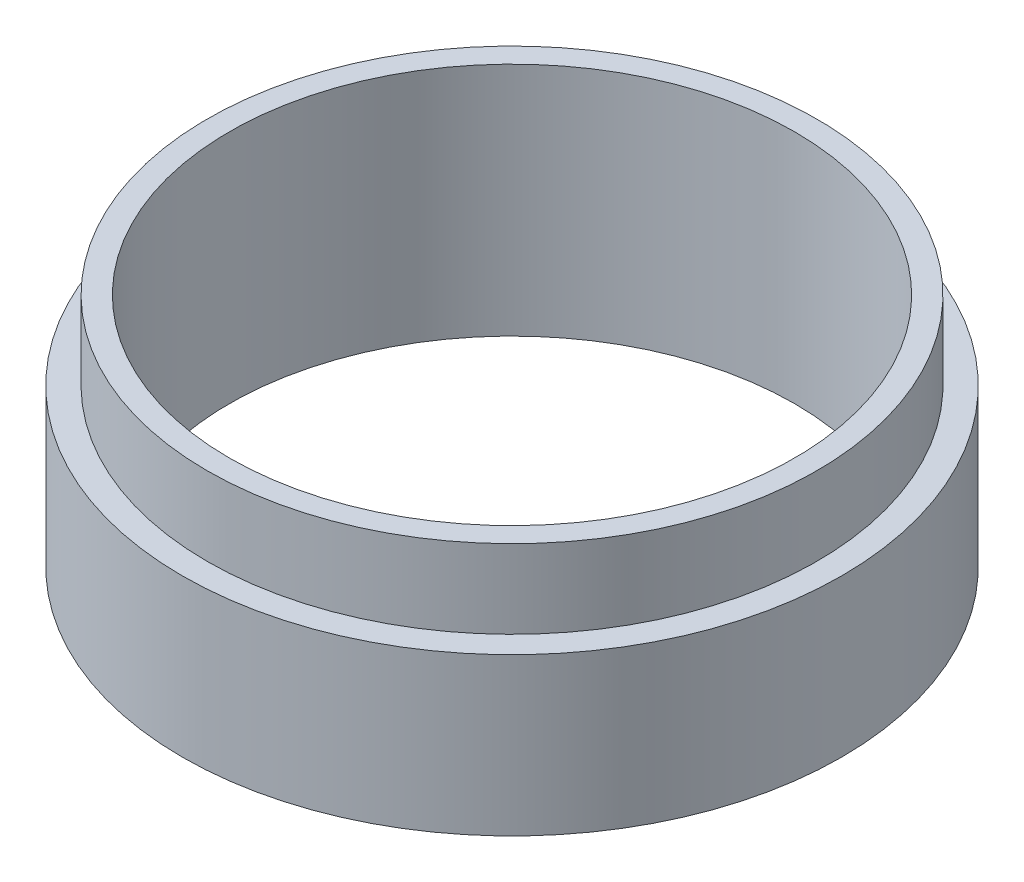
ISO-10303-21;
HEADER;
FILE_DESCRIPTION(('STEP AP214'),'2;1');
FILE_NAME('part.step','',(''),(''),'','','');
FILE_SCHEMA(('AUTOMOTIVE_DESIGN { 1 0 10303 214 1 1 1 1 }'));
ENDSEC;
DATA;
#1=APPLICATION_CONTEXT('core data for automotive mechanical design processes');
#2=APPLICATION_PROTOCOL_DEFINITION('international standard','automotive_design',2000,#1);
#3=PRODUCT_CONTEXT('',#1,'mechanical');
#4=PRODUCT('Part','Part','',(#3));
#5=PRODUCT_RELATED_PRODUCT_CATEGORY('part','',(#4));
#6=PRODUCT_DEFINITION_FORMATION('','',#4);
#7=PRODUCT_DEFINITION_CONTEXT('part definition',#1,'design');
#8=PRODUCT_DEFINITION('design','',#6,#7);
#9=PRODUCT_DEFINITION_SHAPE('','',#8);
#10=(LENGTH_UNIT() NAMED_UNIT(*) SI_UNIT(.MILLI.,.METRE.));
#11=(NAMED_UNIT(*) PLANE_ANGLE_UNIT() SI_UNIT($,.RADIAN.));
#12=(NAMED_UNIT(*) SI_UNIT($,.STERADIAN.) SOLID_ANGLE_UNIT());
#13=UNCERTAINTY_MEASURE_WITH_UNIT(LENGTH_MEASURE(1.E-05),#10,'distance_accuracy_value','');
#14=(GEOMETRIC_REPRESENTATION_CONTEXT(3) GLOBAL_UNCERTAINTY_ASSIGNED_CONTEXT((#13)) GLOBAL_UNIT_ASSIGNED_CONTEXT((#10,
#11,#12)) REPRESENTATION_CONTEXT('',''));
#15=CARTESIAN_POINT('',(0.,0.,0.));
#16=DIRECTION('',(0.,0.,1.));
#17=DIRECTION('',(1.,0.,0.));
#18=AXIS2_PLACEMENT_3D('',#15,#16,#17);
#19=CARTESIAN_POINT('',(0.,0.,0.));
#20=DIRECTION('',(0.,-1.,0.));
#21=DIRECTION('',(0.,0.,-1.));
#22=AXIS2_PLACEMENT_3D('',#19,#20,#21);
#23=CYLINDRICAL_SURFACE('',#22,21.);
#24=CARTESIAN_POINT('',(0.,10.,0.));
#25=DIRECTION('',(0.,-1.,0.));
#26=DIRECTION('',(0.,0.,-1.));
#27=AXIS2_PLACEMENT_3D('',#24,#25,#26);
#28=CIRCLE('',#27,21.);
#29=CARTESIAN_POINT('',(0.,10.,-21.));
#30=VERTEX_POINT('',#29);
#31=EDGE_CURVE('E37',#30,#30,#28,.T.);
#32=ORIENTED_EDGE('',*,*,#31,.T.);
#33=EDGE_LOOP('',(#32));
#34=FACE_BOUND('',#33,.T.);
#35=CARTESIAN_POINT('',(0.,0.,0.));
#36=DIRECTION('',(0.,-1.,0.));
#37=DIRECTION('',(0.,0.,-1.));
#38=AXIS2_PLACEMENT_3D('',#35,#36,#37);
#39=CIRCLE('',#38,21.);
#40=CARTESIAN_POINT('',(0.,0.,-21.));
#41=VERTEX_POINT('',#40);
#42=EDGE_CURVE('E48',#41,#41,#39,.T.);
#43=ORIENTED_EDGE('',*,*,#42,.F.);
#44=EDGE_LOOP('',(#43));
#45=FACE_BOUND('',#44,.T.);
#46=ADVANCED_FACE('F40',(#34,#45),#23,.T.);
#47=CARTESIAN_POINT('',(0.,10.,0.));
#48=DIRECTION('',(0.,1.,0.));
#49=DIRECTION('',(0.,0.,1.));
#50=AXIS2_PLACEMENT_3D('',#47,#48,#49);
#51=PLANE('',#50);
#52=CARTESIAN_POINT('',(0.,10.,0.));
#53=DIRECTION('',(0.,1.,0.));
#54=DIRECTION('',(0.,0.,1.));
#55=AXIS2_PLACEMENT_3D('',#52,#53,#54);
#56=CIRCLE('',#55,19.41);
#57=CARTESIAN_POINT('',(0.,10.,19.41));
#58=VERTEX_POINT('',#57);
#59=EDGE_CURVE('E10',#58,#58,#56,.T.);
#60=ORIENTED_EDGE('',*,*,#59,.F.);
#61=EDGE_LOOP('',(#60));
#62=FACE_BOUND('',#61,.T.);
#63=ORIENTED_EDGE('',*,*,#31,.F.);
#64=EDGE_LOOP('',(#63));
#65=FACE_BOUND('',#64,.T.);
#66=ADVANCED_FACE('F61',(#62,#65),#51,.T.);
#67=CARTESIAN_POINT('',(0.,0.,0.));
#68=DIRECTION('',(0.,-1.,0.));
#69=DIRECTION('',(0.,0.,-1.));
#70=AXIS2_PLACEMENT_3D('',#67,#68,#69);
#71=PLANE('',#70);
#72=CARTESIAN_POINT('',(0.,0.,0.));
#73=DIRECTION('',(0.,1.,0.));
#74=DIRECTION('',(0.,0.,1.));
#75=AXIS2_PLACEMENT_3D('',#72,#73,#74);
#76=CIRCLE('',#75,18.);
#77=CARTESIAN_POINT('',(0.,0.,18.));
#78=VERTEX_POINT('',#77);
#79=EDGE_CURVE('E52',#78,#78,#76,.T.);
#80=ORIENTED_EDGE('',*,*,#79,.T.);
#81=EDGE_LOOP('',(#80));
#82=FACE_BOUND('',#81,.T.);
#83=ORIENTED_EDGE('',*,*,#42,.T.);
#84=EDGE_LOOP('',(#83));
#85=FACE_BOUND('',#84,.T.);
#86=ADVANCED_FACE('F59',(#82,#85),#71,.T.);
#87=CARTESIAN_POINT('',(0.,0.,0.));
#88=DIRECTION('',(0.,1.,0.));
#89=DIRECTION('',(0.,0.,1.));
#90=AXIS2_PLACEMENT_3D('',#87,#88,#89);
#91=CYLINDRICAL_SURFACE('',#90,18.);
#92=ORIENTED_EDGE('',*,*,#79,.F.);
#93=EDGE_LOOP('',(#92));
#94=FACE_BOUND('',#93,.T.);
#95=CARTESIAN_POINT('',(0.,15.,0.));
#96=DIRECTION('',(0.,1.,0.));
#97=DIRECTION('',(0.,0.,1.));
#98=AXIS2_PLACEMENT_3D('',#95,#96,#97);
#99=CIRCLE('',#98,18.);
#100=CARTESIAN_POINT('',(0.,15.,18.));
#101=VERTEX_POINT('',#100);
#102=EDGE_CURVE('E93',#101,#101,#99,.T.);
#103=ORIENTED_EDGE('',*,*,#102,.T.);
#104=EDGE_LOOP('',(#103));
#105=FACE_BOUND('',#104,.T.);
#106=ADVANCED_FACE('F71',(#94,#105),#91,.F.);
#107=CARTESIAN_POINT('',(0.,15.,0.));
#108=DIRECTION('',(0.,1.,0.));
#109=DIRECTION('',(0.,0.,1.));
#110=AXIS2_PLACEMENT_3D('',#107,#108,#109);
#111=PLANE('',#110);
#112=ORIENTED_EDGE('',*,*,#102,.F.);
#113=EDGE_LOOP('',(#112));
#114=FACE_BOUND('',#113,.T.);
#115=CARTESIAN_POINT('',(0.,15.,0.));
#116=DIRECTION('',(0.,1.,0.));
#117=DIRECTION('',(0.,0.,1.));
#118=AXIS2_PLACEMENT_3D('',#115,#116,#117);
#119=CIRCLE('',#118,19.41);
#120=CARTESIAN_POINT('',(0.,15.,19.41));
#121=VERTEX_POINT('',#120);
#122=EDGE_CURVE('E51',#121,#121,#119,.T.);
#123=ORIENTED_EDGE('',*,*,#122,.T.);
#124=EDGE_LOOP('',(#123));
#125=FACE_BOUND('',#124,.T.);
#126=ADVANCED_FACE('F78',(#114,#125),#111,.T.);
#127=CARTESIAN_POINT('',(0.,15.,0.));
#128=DIRECTION('',(0.,-1.,0.));
#129=DIRECTION('',(0.,0.,-1.));
#130=AXIS2_PLACEMENT_3D('',#127,#128,#129);
#131=CYLINDRICAL_SURFACE('',#130,19.41);
#132=ORIENTED_EDGE('',*,*,#122,.F.);
#133=EDGE_LOOP('',(#132));
#134=FACE_BOUND('',#133,.T.);
#135=ORIENTED_EDGE('',*,*,#59,.T.);
#136=EDGE_LOOP('',(#135));
#137=FACE_BOUND('',#136,.T.);
#138=ADVANCED_FACE('F83',(#134,#137),#131,.T.);
#139=CLOSED_SHELL('',(#46,#66,#86,#106,#126,#138));
#140=MANIFOLD_SOLID_BREP('B2',#139);
#141=ADVANCED_BREP_SHAPE_REPRESENTATION('',(#18,#140),#14);
#142=SHAPE_DEFINITION_REPRESENTATION(#9,#141);
ENDSEC;
END-ISO-10303-21;
